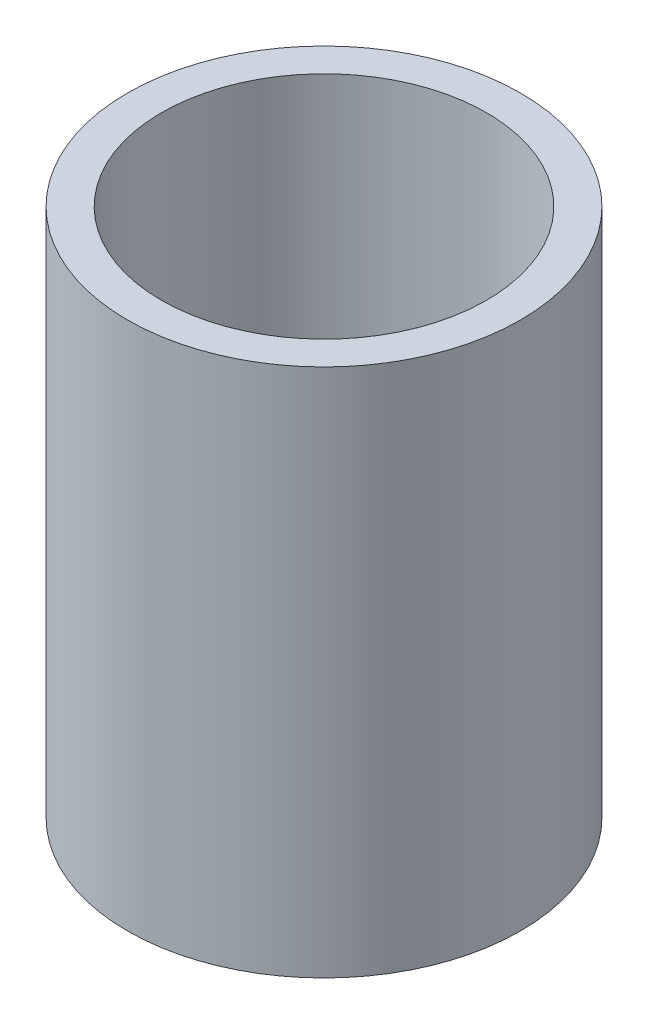
ISO-10303-21;
HEADER;
FILE_DESCRIPTION(('STEP AP214'),'2;1');
FILE_NAME('part.step','',(''),(''),'','','');
FILE_SCHEMA(('AUTOMOTIVE_DESIGN { 1 0 10303 214 1 1 1 1 }'));
ENDSEC;
DATA;
#1=APPLICATION_CONTEXT('core data for automotive mechanical design processes');
#2=APPLICATION_PROTOCOL_DEFINITION('international standard','automotive_design',2000,#1);
#3=PRODUCT_CONTEXT('',#1,'mechanical');
#4=PRODUCT('Part','Part','',(#3));
#5=PRODUCT_RELATED_PRODUCT_CATEGORY('part','',(#4));
#6=PRODUCT_DEFINITION_FORMATION('','',#4);
#7=PRODUCT_DEFINITION_CONTEXT('part definition',#1,'design');
#8=PRODUCT_DEFINITION('design','',#6,#7);
#9=PRODUCT_DEFINITION_SHAPE('','',#8);
#10=(LENGTH_UNIT() NAMED_UNIT(*) SI_UNIT(.MILLI.,.METRE.));
#11=(NAMED_UNIT(*) PLANE_ANGLE_UNIT() SI_UNIT($,.RADIAN.));
#12=(NAMED_UNIT(*) SI_UNIT($,.STERADIAN.) SOLID_ANGLE_UNIT());
#13=UNCERTAINTY_MEASURE_WITH_UNIT(LENGTH_MEASURE(1.E-05),#10,'distance_accuracy_value','');
#14=(GEOMETRIC_REPRESENTATION_CONTEXT(3) GLOBAL_UNCERTAINTY_ASSIGNED_CONTEXT((#13)) GLOBAL_UNIT_ASSIGNED_CONTEXT((#10,
#11,#12)) REPRESENTATION_CONTEXT('',''));
#15=CARTESIAN_POINT('',(0.,0.,0.));
#16=DIRECTION('',(0.,0.,1.));
#17=DIRECTION('',(1.,0.,0.));
#18=AXIS2_PLACEMENT_3D('',#15,#16,#17);
#19=CARTESIAN_POINT('',(0.,35.,0.));
#20=DIRECTION('',(0.,1.,0.));
#21=DIRECTION('',(0.,0.,1.));
#22=AXIS2_PLACEMENT_3D('',#19,#20,#21);
#23=PLANE('',#22);
#24=CARTESIAN_POINT('',(0.,35.,0.));
#25=DIRECTION('',(0.,1.,0.));
#26=DIRECTION('',(0.,0.,1.));
#27=AXIS2_PLACEMENT_3D('',#24,#25,#26);
#28=CIRCLE('',#27,13.);
#29=CARTESIAN_POINT('',(0.,35.,13.));
#30=VERTEX_POINT('',#29);
#31=EDGE_CURVE('E11',#30,#30,#28,.T.);
#32=ORIENTED_EDGE('',*,*,#31,.T.);
#33=EDGE_LOOP('',(#32));
#34=FACE_BOUND('',#33,.T.);
#35=CARTESIAN_POINT('',(0.,35.,0.));
#36=DIRECTION('',(0.,1.,0.));
#37=DIRECTION('',(0.,0.,1.));
#38=AXIS2_PLACEMENT_3D('',#35,#36,#37);
#39=CIRCLE('',#38,10.75);
#40=CARTESIAN_POINT('',(0.,35.,10.75));
#41=VERTEX_POINT('',#40);
#42=EDGE_CURVE('E59',#41,#41,#39,.T.);
#43=ORIENTED_EDGE('',*,*,#42,.F.);
#44=EDGE_LOOP('',(#43));
#45=FACE_BOUND('',#44,.T.);
#46=ADVANCED_FACE('F48',(#34,#45),#23,.T.);
#47=CARTESIAN_POINT('',(0.,0.,0.));
#48=DIRECTION('',(0.,1.,0.));
#49=DIRECTION('',(0.,0.,1.));
#50=AXIS2_PLACEMENT_3D('',#47,#48,#49);
#51=PLANE('',#50);
#52=CARTESIAN_POINT('',(0.,0.,0.));
#53=DIRECTION('',(0.,1.,0.));
#54=DIRECTION('',(0.,0.,1.));
#55=AXIS2_PLACEMENT_3D('',#52,#53,#54);
#56=CIRCLE('',#55,13.);
#57=CARTESIAN_POINT('',(0.,0.,13.));
#58=VERTEX_POINT('',#57);
#59=EDGE_CURVE('E52',#58,#58,#56,.T.);
#60=ORIENTED_EDGE('',*,*,#59,.F.);
#61=EDGE_LOOP('',(#60));
#62=FACE_BOUND('',#61,.T.);
#63=CARTESIAN_POINT('',(0.,0.,0.));
#64=DIRECTION('',(0.,1.,0.));
#65=DIRECTION('',(0.,0.,1.));
#66=AXIS2_PLACEMENT_3D('',#63,#64,#65);
#67=CIRCLE('',#66,10.75);
#68=CARTESIAN_POINT('',(0.,0.,10.75));
#69=VERTEX_POINT('',#68);
#70=EDGE_CURVE('E61',#69,#69,#67,.T.);
#71=ORIENTED_EDGE('',*,*,#70,.T.);
#72=EDGE_LOOP('',(#71));
#73=FACE_BOUND('',#72,.T.);
#74=ADVANCED_FACE('F82',(#62,#73),#51,.F.);
#75=CARTESIAN_POINT('',(0.,35.,0.));
#76=DIRECTION('',(0.,-1.,0.));
#77=DIRECTION('',(0.,0.,-1.));
#78=AXIS2_PLACEMENT_3D('',#75,#76,#77);
#79=CYLINDRICAL_SURFACE('',#78,13.);
#80=ORIENTED_EDGE('',*,*,#31,.F.);
#81=EDGE_LOOP('',(#80));
#82=FACE_BOUND('',#81,.T.);
#83=ORIENTED_EDGE('',*,*,#59,.T.);
#84=EDGE_LOOP('',(#83));
#85=FACE_BOUND('',#84,.T.);
#86=ADVANCED_FACE('F50',(#82,#85),#79,.T.);
#87=CARTESIAN_POINT('',(0.,35.,0.));
#88=DIRECTION('',(0.,-1.,0.));
#89=DIRECTION('',(0.,0.,-1.));
#90=AXIS2_PLACEMENT_3D('',#87,#88,#89);
#91=CYLINDRICAL_SURFACE('',#90,10.75);
#92=ORIENTED_EDGE('',*,*,#42,.T.);
#93=EDGE_LOOP('',(#92));
#94=FACE_BOUND('',#93,.T.);
#95=ORIENTED_EDGE('',*,*,#70,.F.);
#96=EDGE_LOOP('',(#95));
#97=FACE_BOUND('',#96,.T.);
#98=ADVANCED_FACE('F78',(#94,#97),#91,.F.);
#99=CLOSED_SHELL('',(#46,#74,#86,#98));
#100=MANIFOLD_SOLID_BREP('B2',#99);
#101=ADVANCED_BREP_SHAPE_REPRESENTATION('',(#18,#100),#14);
#102=SHAPE_DEFINITION_REPRESENTATION(#9,#101);
ENDSEC;
END-ISO-10303-21;
